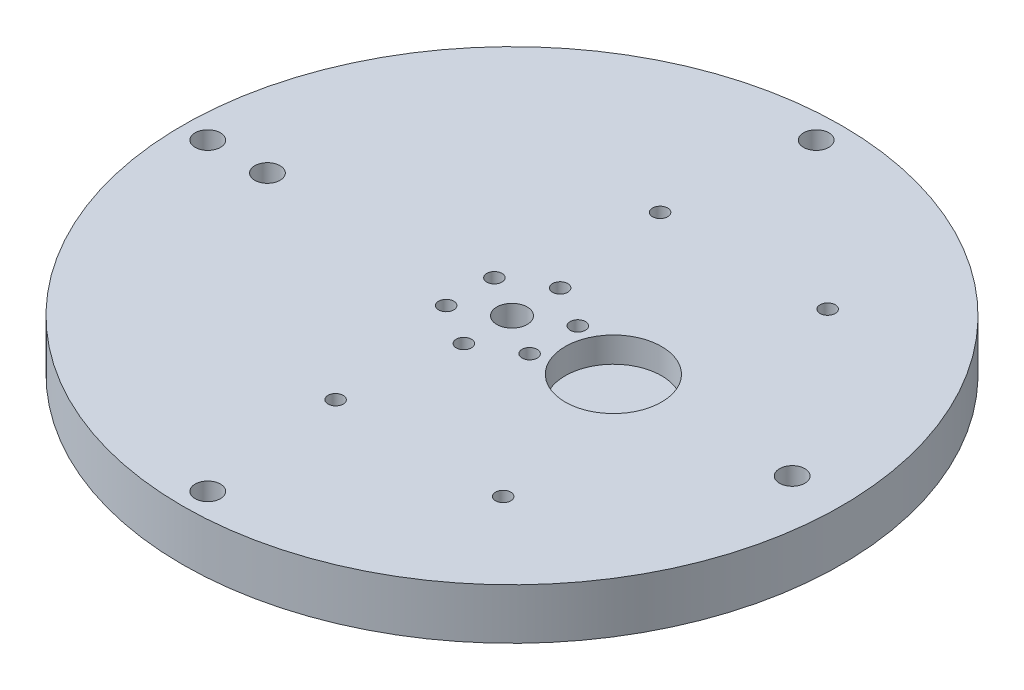
ISO-10303-21;
HEADER;
FILE_DESCRIPTION(('STEP AP214'),'2;1');
FILE_NAME('part.step','',(''),(''),'','','');
FILE_SCHEMA(('AUTOMOTIVE_DESIGN { 1 0 10303 214 1 1 1 1 }'));
ENDSEC;
DATA;
#1=APPLICATION_CONTEXT('core data for automotive mechanical design processes');
#2=APPLICATION_PROTOCOL_DEFINITION('international standard','automotive_design',2000,#1);
#3=PRODUCT_CONTEXT('',#1,'mechanical');
#4=PRODUCT('Part','Part','',(#3));
#5=PRODUCT_RELATED_PRODUCT_CATEGORY('part','',(#4));
#6=PRODUCT_DEFINITION_FORMATION('','',#4);
#7=PRODUCT_DEFINITION_CONTEXT('part definition',#1,'design');
#8=PRODUCT_DEFINITION('design','',#6,#7);
#9=PRODUCT_DEFINITION_SHAPE('','',#8);
#10=(LENGTH_UNIT() NAMED_UNIT(*) SI_UNIT(.MILLI.,.METRE.));
#11=(NAMED_UNIT(*) PLANE_ANGLE_UNIT() SI_UNIT($,.RADIAN.));
#12=(NAMED_UNIT(*) SI_UNIT($,.STERADIAN.) SOLID_ANGLE_UNIT());
#13=UNCERTAINTY_MEASURE_WITH_UNIT(LENGTH_MEASURE(1.E-05),#10,'distance_accuracy_value','');
#14=(GEOMETRIC_REPRESENTATION_CONTEXT(3) GLOBAL_UNCERTAINTY_ASSIGNED_CONTEXT((#13)) GLOBAL_UNIT_ASSIGNED_CONTEXT((#10,
#11,#12)) REPRESENTATION_CONTEXT('',''));
#15=CARTESIAN_POINT('',(0.,0.,0.));
#16=DIRECTION('',(0.,0.,1.));
#17=DIRECTION('',(1.,0.,0.));
#18=AXIS2_PLACEMENT_3D('',#15,#16,#17);
#19=CARTESIAN_POINT('',(-48.498731336808,0.,-0.260845552466508));
#20=DIRECTION('',(0.,1.,0.));
#21=DIRECTION('',(0.,0.,1.));
#22=AXIS2_PLACEMENT_3D('',#19,#20,#21);
#23=CYLINDRICAL_SURFACE('',#22,2.50000000000001);
#24=CARTESIAN_POINT('',(-48.498731336808,10.,-0.260845552466508));
#25=DIRECTION('',(0.,1.,0.));
#26=DIRECTION('',(0.,0.,1.));
#27=AXIS2_PLACEMENT_3D('',#24,#25,#26);
#28=CIRCLE('',#27,2.50000000000001);
#29=CARTESIAN_POINT('',(-48.498731336808,10.,2.2391544475335));
#30=VERTEX_POINT('',#29);
#31=EDGE_CURVE('E381',#30,#30,#28,.T.);
#32=ORIENTED_EDGE('',*,*,#31,.T.);
#33=EDGE_LOOP('',(#32));
#34=FACE_BOUND('',#33,.T.);
#35=CARTESIAN_POINT('',(-48.498731336808,5.,-0.260845552466508));
#36=DIRECTION('',(0.,-1.,0.));
#37=DIRECTION('',(0.,0.,-1.));
#38=AXIS2_PLACEMENT_3D('',#35,#36,#37);
#39=CIRCLE('',#38,2.50000000000001);
#40=CARTESIAN_POINT('',(-48.498731336808,5.,-2.76084555246652));
#41=VERTEX_POINT('',#40);
#42=EDGE_CURVE('E37',#41,#41,#39,.F.);
#43=ORIENTED_EDGE('',*,*,#42,.F.);
#44=EDGE_LOOP('',(#43));
#45=FACE_BOUND('',#44,.T.);
#46=ADVANCED_FACE('F33',(#34,#45),#23,.F.);
#47=CARTESIAN_POINT('',(-3.04873870426604,10.,-32.2608455524665));
#48=DIRECTION('',(0.,-1.,0.));
#49=DIRECTION('',(0.,0.,-1.));
#50=AXIS2_PLACEMENT_3D('',#47,#48,#49);
#51=CYLINDRICAL_SURFACE('',#50,1.50000000000003);
#52=CARTESIAN_POINT('',(-3.04873870426604,10.,-32.2608455524665));
#53=DIRECTION('',(0.,1.,0.));
#54=DIRECTION('',(0.,0.,1.));
#55=AXIS2_PLACEMENT_3D('',#52,#53,#54);
#56=CIRCLE('',#55,1.50000000000003);
#57=CARTESIAN_POINT('',(-3.04873870426604,10.,-30.7608455524665));
#58=VERTEX_POINT('',#57);
#59=EDGE_CURVE('E135',#58,#58,#56,.T.);
#60=ORIENTED_EDGE('',*,*,#59,.T.);
#61=EDGE_LOOP('',(#60));
#62=FACE_BOUND('',#61,.T.);
#63=CARTESIAN_POINT('',(-3.04873870426604,5.,-32.2608455524665));
#64=DIRECTION('',(0.,-1.,0.));
#65=DIRECTION('',(0.,0.,-1.));
#66=AXIS2_PLACEMENT_3D('',#63,#64,#65);
#67=CIRCLE('',#66,1.50000000000003);
#68=CARTESIAN_POINT('',(-3.04873870426604,5.,-33.7608455524666));
#69=VERTEX_POINT('',#68);
#70=EDGE_CURVE('E64',#69,#69,#67,.T.);
#71=ORIENTED_EDGE('',*,*,#70,.T.);
#72=EDGE_LOOP('',(#71));
#73=FACE_BOUND('',#72,.T.);
#74=ADVANCED_FACE('F182',(#62,#73),#51,.F.);
#75=CARTESIAN_POINT('',(30.0012686631919,10.,-32.2608455524665));
#76=DIRECTION('',(0.,-1.,0.));
#77=DIRECTION('',(0.,0.,-1.));
#78=AXIS2_PLACEMENT_3D('',#75,#76,#77);
#79=CYLINDRICAL_SURFACE('',#78,1.50000000000003);
#80=CARTESIAN_POINT('',(30.0012686631919,10.,-32.2608455524665));
#81=DIRECTION('',(0.,1.,0.));
#82=DIRECTION('',(0.,0.,1.));
#83=AXIS2_PLACEMENT_3D('',#80,#81,#82);
#84=CIRCLE('',#83,1.50000000000003);
#85=CARTESIAN_POINT('',(30.0012686631919,10.,-30.7608455524665));
#86=VERTEX_POINT('',#85);
#87=EDGE_CURVE('E132',#86,#86,#84,.T.);
#88=ORIENTED_EDGE('',*,*,#87,.T.);
#89=EDGE_LOOP('',(#88));
#90=FACE_BOUND('',#89,.T.);
#91=CARTESIAN_POINT('',(30.0012686631919,5.,-32.2608455524665));
#92=DIRECTION('',(0.,-1.,0.));
#93=DIRECTION('',(0.,0.,-1.));
#94=AXIS2_PLACEMENT_3D('',#91,#92,#93);
#95=CIRCLE('',#94,1.50000000000003);
#96=CARTESIAN_POINT('',(30.0012686631919,5.,-33.7608455524666));
#97=VERTEX_POINT('',#96);
#98=EDGE_CURVE('E62',#97,#97,#95,.T.);
#99=ORIENTED_EDGE('',*,*,#98,.T.);
#100=EDGE_LOOP('',(#99));
#101=FACE_BOUND('',#100,.T.);
#102=ADVANCED_FACE('F188',(#90,#101),#79,.F.);
#103=CARTESIAN_POINT('',(30.001268663192,10.,31.7391544475335));
#104=DIRECTION('',(0.,-1.,0.));
#105=DIRECTION('',(0.,0.,-1.));
#106=AXIS2_PLACEMENT_3D('',#103,#104,#105);
#107=CYLINDRICAL_SURFACE('',#106,1.50000000000003);
#108=CARTESIAN_POINT('',(30.001268663192,10.,31.7391544475335));
#109=DIRECTION('',(0.,1.,0.));
#110=DIRECTION('',(0.,0.,1.));
#111=AXIS2_PLACEMENT_3D('',#108,#109,#110);
#112=CIRCLE('',#111,1.50000000000003);
#113=CARTESIAN_POINT('',(30.001268663192,10.,33.2391544475335));
#114=VERTEX_POINT('',#113);
#115=EDGE_CURVE('E129',#114,#114,#112,.T.);
#116=ORIENTED_EDGE('',*,*,#115,.T.);
#117=EDGE_LOOP('',(#116));
#118=FACE_BOUND('',#117,.T.);
#119=CARTESIAN_POINT('',(30.001268663192,5.,31.7391544475335));
#120=DIRECTION('',(0.,-1.,0.));
#121=DIRECTION('',(0.,0.,-1.));
#122=AXIS2_PLACEMENT_3D('',#119,#120,#121);
#123=CIRCLE('',#122,1.50000000000003);
#124=CARTESIAN_POINT('',(30.001268663192,5.,30.2391544475334));
#125=VERTEX_POINT('',#124);
#126=EDGE_CURVE('E59',#125,#125,#123,.T.);
#127=ORIENTED_EDGE('',*,*,#126,.T.);
#128=EDGE_LOOP('',(#127));
#129=FACE_BOUND('',#128,.T.);
#130=ADVANCED_FACE('F314',(#118,#129),#107,.F.);
#131=CARTESIAN_POINT('',(-3.04873870426606,10.,31.7391544475334));
#132=DIRECTION('',(0.,-1.,0.));
#133=DIRECTION('',(0.,0.,-1.));
#134=AXIS2_PLACEMENT_3D('',#131,#132,#133);
#135=CYLINDRICAL_SURFACE('',#134,1.50000000000003);
#136=CARTESIAN_POINT('',(-3.04873870426606,10.,31.7391544475334));
#137=DIRECTION('',(0.,1.,0.));
#138=DIRECTION('',(0.,0.,1.));
#139=AXIS2_PLACEMENT_3D('',#136,#137,#138);
#140=CIRCLE('',#139,1.50000000000003);
#141=CARTESIAN_POINT('',(-3.04873870426606,10.,33.2391544475335));
#142=VERTEX_POINT('',#141);
#143=EDGE_CURVE('E126',#142,#142,#140,.T.);
#144=ORIENTED_EDGE('',*,*,#143,.T.);
#145=EDGE_LOOP('',(#144));
#146=FACE_BOUND('',#145,.T.);
#147=CARTESIAN_POINT('',(-3.04873870426606,5.,31.7391544475334));
#148=DIRECTION('',(0.,-1.,0.));
#149=DIRECTION('',(0.,0.,-1.));
#150=AXIS2_PLACEMENT_3D('',#147,#148,#149);
#151=CIRCLE('',#150,1.50000000000003);
#152=CARTESIAN_POINT('',(-3.04873870426606,5.,30.2391544475334));
#153=VERTEX_POINT('',#152);
#154=EDGE_CURVE('E55',#153,#153,#151,.T.);
#155=ORIENTED_EDGE('',*,*,#154,.T.);
#156=EDGE_LOOP('',(#155));
#157=FACE_BOUND('',#156,.T.);
#158=ADVANCED_FACE('F318',(#146,#157),#135,.F.);
#159=CARTESIAN_POINT('',(55.0012686631919,10.,-0.260845552466547));
#160=DIRECTION('',(0.,-1.,0.));
#161=DIRECTION('',(0.,0.,-1.));
#162=AXIS2_PLACEMENT_3D('',#159,#160,#161);
#163=CYLINDRICAL_SURFACE('',#162,2.49999999999999);
#164=CARTESIAN_POINT('',(55.0012686631919,10.,-0.260845552466547));
#165=DIRECTION('',(0.,1.,0.));
#166=DIRECTION('',(0.,0.,1.));
#167=AXIS2_PLACEMENT_3D('',#164,#165,#166);
#168=CIRCLE('',#167,2.49999999999999);
#169=CARTESIAN_POINT('',(55.0012686631919,10.,2.23915444753345));
#170=VERTEX_POINT('',#169);
#171=EDGE_CURVE('E103',#170,#170,#168,.T.);
#172=ORIENTED_EDGE('',*,*,#171,.T.);
#173=EDGE_LOOP('',(#172));
#174=FACE_BOUND('',#173,.T.);
#175=CARTESIAN_POINT('',(55.0012686631919,5.,-0.260845552466547));
#176=DIRECTION('',(0.,-1.,0.));
#177=DIRECTION('',(0.,0.,-1.));
#178=AXIS2_PLACEMENT_3D('',#175,#176,#177);
#179=CIRCLE('',#178,2.49999999999999);
#180=CARTESIAN_POINT('',(55.0012686631919,5.,-2.76084555246654));
#181=VERTEX_POINT('',#180);
#182=EDGE_CURVE('E52',#181,#181,#179,.T.);
#183=ORIENTED_EDGE('',*,*,#182,.T.);
#184=EDGE_LOOP('',(#183));
#185=FACE_BOUND('',#184,.T.);
#186=ADVANCED_FACE('F35',(#174,#185),#163,.F.);
#187=CARTESIAN_POINT('',(0.,10.,-9.5));
#188=DIRECTION('',(0.,-1.,0.));
#189=DIRECTION('',(0.,0.,-1.));
#190=AXIS2_PLACEMENT_3D('',#187,#188,#189);
#191=CYLINDRICAL_SURFACE('',#190,1.5);
#192=CARTESIAN_POINT('',(0.,10.,-9.5));
#193=DIRECTION('',(0.,1.,0.));
#194=DIRECTION('',(0.,0.,1.));
#195=AXIS2_PLACEMENT_3D('',#192,#193,#194);
#196=CIRCLE('',#195,1.5);
#197=CARTESIAN_POINT('',(0.,10.,-8.));
#198=VERTEX_POINT('',#197);
#199=EDGE_CURVE('E46',#198,#198,#196,.T.);
#200=ORIENTED_EDGE('',*,*,#199,.T.);
#201=EDGE_LOOP('',(#200));
#202=FACE_BOUND('',#201,.T.);
#203=CARTESIAN_POINT('',(0.,0.,-9.5));
#204=DIRECTION('',(0.,1.,0.));
#205=DIRECTION('',(0.,0.,1.));
#206=AXIS2_PLACEMENT_3D('',#203,#204,#205);
#207=CIRCLE('',#206,1.5);
#208=CARTESIAN_POINT('',(0.,0.,-8.));
#209=VERTEX_POINT('',#208);
#210=EDGE_CURVE('E98',#209,#209,#207,.T.);
#211=ORIENTED_EDGE('',*,*,#210,.F.);
#212=EDGE_LOOP('',(#211));
#213=FACE_BOUND('',#212,.T.);
#214=ADVANCED_FACE('F158',(#202,#213),#191,.F.);
#215=CARTESIAN_POINT('',(8.22724133595243,10.,-4.75000000000047));
#216=DIRECTION('',(0.,-1.,0.));
#217=DIRECTION('',(0.,0.,-1.));
#218=AXIS2_PLACEMENT_3D('',#215,#216,#217);
#219=CYLINDRICAL_SURFACE('',#218,1.50000000000014);
#220=CARTESIAN_POINT('',(8.22724133595243,10.,-4.75000000000047));
#221=DIRECTION('',(0.,1.,0.));
#222=DIRECTION('',(0.,0.,1.));
#223=AXIS2_PLACEMENT_3D('',#220,#221,#222);
#224=CIRCLE('',#223,1.50000000000014);
#225=CARTESIAN_POINT('',(8.22724133595243,10.,-3.25000000000032));
#226=VERTEX_POINT('',#225);
#227=EDGE_CURVE('E153',#226,#226,#224,.T.);
#228=ORIENTED_EDGE('',*,*,#227,.T.);
#229=EDGE_LOOP('',(#228));
#230=FACE_BOUND('',#229,.T.);
#231=CARTESIAN_POINT('',(8.22724133595243,0.,-4.75000000000047));
#232=DIRECTION('',(0.,1.,0.));
#233=DIRECTION('',(0.,0.,1.));
#234=AXIS2_PLACEMENT_3D('',#231,#232,#233);
#235=CIRCLE('',#234,1.50000000000014);
#236=CARTESIAN_POINT('',(8.22724133595243,0.,-3.25000000000032));
#237=VERTEX_POINT('',#236);
#238=EDGE_CURVE('E96',#237,#237,#235,.T.);
#239=ORIENTED_EDGE('',*,*,#238,.F.);
#240=EDGE_LOOP('',(#239));
#241=FACE_BOUND('',#240,.T.);
#242=ADVANCED_FACE('F283',(#230,#241),#219,.F.);
#243=CARTESIAN_POINT('',(8.22724133595298,10.,4.74999999999953));
#244=DIRECTION('',(0.,-1.,0.));
#245=DIRECTION('',(0.,0.,-1.));
#246=AXIS2_PLACEMENT_3D('',#243,#244,#245);
#247=CYLINDRICAL_SURFACE('',#246,1.50000000000068);
#248=CARTESIAN_POINT('',(8.22724133595298,10.,4.74999999999953));
#249=DIRECTION('',(0.,1.,0.));
#250=DIRECTION('',(0.,0.,1.));
#251=AXIS2_PLACEMENT_3D('',#248,#249,#250);
#252=CIRCLE('',#251,1.50000000000068);
#253=CARTESIAN_POINT('',(8.22724133595298,10.,6.25000000000021));
#254=VERTEX_POINT('',#253);
#255=EDGE_CURVE('E150',#254,#254,#252,.T.);
#256=ORIENTED_EDGE('',*,*,#255,.T.);
#257=EDGE_LOOP('',(#256));
#258=FACE_BOUND('',#257,.T.);
#259=CARTESIAN_POINT('',(8.22724133595298,0.,4.74999999999953));
#260=DIRECTION('',(0.,1.,0.));
#261=DIRECTION('',(0.,0.,1.));
#262=AXIS2_PLACEMENT_3D('',#259,#260,#261);
#263=CIRCLE('',#262,1.50000000000068);
#264=CARTESIAN_POINT('',(8.22724133595298,0.,6.25000000000021));
#265=VERTEX_POINT('',#264);
#266=EDGE_CURVE('E93',#265,#265,#263,.T.);
#267=ORIENTED_EDGE('',*,*,#266,.F.);
#268=EDGE_LOOP('',(#267));
#269=FACE_BOUND('',#268,.T.);
#270=ADVANCED_FACE('F285',(#258,#269),#247,.F.);
#271=CARTESIAN_POINT('',(1.07769812943697E-12,10.,9.5));
#272=DIRECTION('',(0.,-1.,0.));
#273=DIRECTION('',(0.,0.,-1.));
#274=AXIS2_PLACEMENT_3D('',#271,#272,#273);
#275=CYLINDRICAL_SURFACE('',#274,1.50000000000109);
#276=CARTESIAN_POINT('',(1.07769812943697E-12,10.,9.5));
#277=DIRECTION('',(0.,1.,0.));
#278=DIRECTION('',(0.,0.,1.));
#279=AXIS2_PLACEMENT_3D('',#276,#277,#278);
#280=CIRCLE('',#279,1.50000000000109);
#281=CARTESIAN_POINT('',(1.07769812943697E-12,10.,11.0000000000011));
#282=VERTEX_POINT('',#281);
#283=EDGE_CURVE('E147',#282,#282,#280,.T.);
#284=ORIENTED_EDGE('',*,*,#283,.T.);
#285=EDGE_LOOP('',(#284));
#286=FACE_BOUND('',#285,.T.);
#287=CARTESIAN_POINT('',(1.07769812943697E-12,0.,9.5));
#288=DIRECTION('',(0.,1.,0.));
#289=DIRECTION('',(0.,0.,1.));
#290=AXIS2_PLACEMENT_3D('',#287,#288,#289);
#291=CIRCLE('',#290,1.50000000000109);
#292=CARTESIAN_POINT('',(1.07769812943697E-12,0.,11.0000000000011));
#293=VERTEX_POINT('',#292);
#294=EDGE_CURVE('E90',#293,#293,#291,.T.);
#295=ORIENTED_EDGE('',*,*,#294,.F.);
#296=EDGE_LOOP('',(#295));
#297=FACE_BOUND('',#296,.T.);
#298=ADVANCED_FACE('F292',(#286,#297),#275,.F.);
#299=CARTESIAN_POINT('',(-8.22724133595136,10.,4.75000000000047));
#300=DIRECTION('',(0.,-1.,0.));
#301=DIRECTION('',(0.,0.,-1.));
#302=AXIS2_PLACEMENT_3D('',#299,#300,#301);
#303=CYLINDRICAL_SURFACE('',#302,1.50000000000099);
#304=CARTESIAN_POINT('',(-8.22724133595136,10.,4.75000000000047));
#305=DIRECTION('',(0.,1.,0.));
#306=DIRECTION('',(0.,0.,1.));
#307=AXIS2_PLACEMENT_3D('',#304,#305,#306);
#308=CIRCLE('',#307,1.50000000000099);
#309=CARTESIAN_POINT('',(-8.22724133595136,10.,6.25000000000146));
#310=VERTEX_POINT('',#309);
#311=EDGE_CURVE('E144',#310,#310,#308,.T.);
#312=ORIENTED_EDGE('',*,*,#311,.T.);
#313=EDGE_LOOP('',(#312));
#314=FACE_BOUND('',#313,.T.);
#315=CARTESIAN_POINT('',(-8.22724133595136,0.,4.75000000000047));
#316=DIRECTION('',(0.,1.,0.));
#317=DIRECTION('',(0.,0.,1.));
#318=AXIS2_PLACEMENT_3D('',#315,#316,#317);
#319=CIRCLE('',#318,1.50000000000099);
#320=CARTESIAN_POINT('',(-8.22724133595136,0.,6.25000000000146));
#321=VERTEX_POINT('',#320);
#322=EDGE_CURVE('E87',#321,#321,#319,.T.);
#323=ORIENTED_EDGE('',*,*,#322,.F.);
#324=EDGE_LOOP('',(#323));
#325=FACE_BOUND('',#324,.T.);
#326=ADVANCED_FACE('F298',(#314,#325),#303,.F.);
#327=CARTESIAN_POINT('',(-8.2272413359519,10.,-4.74999999999953));
#328=DIRECTION('',(0.,-1.,0.));
#329=DIRECTION('',(0.,0.,-1.));
#330=AXIS2_PLACEMENT_3D('',#327,#328,#329);
#331=CYLINDRICAL_SURFACE('',#330,1.50000000000051);
#332=CARTESIAN_POINT('',(-8.2272413359519,10.,-4.74999999999953));
#333=DIRECTION('',(0.,1.,0.));
#334=DIRECTION('',(0.,0.,1.));
#335=AXIS2_PLACEMENT_3D('',#332,#333,#334);
#336=CIRCLE('',#335,1.50000000000051);
#337=CARTESIAN_POINT('',(-8.2272413359519,10.,-3.24999999999902));
#338=VERTEX_POINT('',#337);
#339=EDGE_CURVE('E141',#338,#338,#336,.T.);
#340=ORIENTED_EDGE('',*,*,#339,.T.);
#341=EDGE_LOOP('',(#340));
#342=FACE_BOUND('',#341,.T.);
#343=CARTESIAN_POINT('',(-8.2272413359519,0.,-4.74999999999953));
#344=DIRECTION('',(0.,1.,0.));
#345=DIRECTION('',(0.,0.,1.));
#346=AXIS2_PLACEMENT_3D('',#343,#344,#345);
#347=CIRCLE('',#346,1.50000000000051);
#348=CARTESIAN_POINT('',(-8.2272413359519,0.,-3.24999999999902));
#349=VERTEX_POINT('',#348);
#350=EDGE_CURVE('E84',#349,#349,#347,.T.);
#351=ORIENTED_EDGE('',*,*,#350,.F.);
#352=EDGE_LOOP('',(#351));
#353=FACE_BOUND('',#352,.T.);
#354=ADVANCED_FACE('F302',(#342,#353),#331,.F.);
#355=CARTESIAN_POINT('',(20.,10.,0.));
#356=DIRECTION('',(0.,-1.,0.));
#357=DIRECTION('',(0.,0.,-1.));
#358=AXIS2_PLACEMENT_3D('',#355,#356,#357);
#359=CYLINDRICAL_SURFACE('',#358,9.5);
#360=CARTESIAN_POINT('',(20.,5.,0.));
#361=DIRECTION('',(0.,1.,0.));
#362=DIRECTION('',(0.,0.,1.));
#363=AXIS2_PLACEMENT_3D('',#360,#361,#362);
#364=CIRCLE('',#363,9.5);
#365=CARTESIAN_POINT('',(20.,5.,9.5));
#366=VERTEX_POINT('',#365);
#367=EDGE_CURVE('E10',#366,#366,#364,.T.);
#368=ORIENTED_EDGE('',*,*,#367,.F.);
#369=EDGE_LOOP('',(#368));
#370=FACE_BOUND('',#369,.T.);
#371=CARTESIAN_POINT('',(20.,10.,0.));
#372=DIRECTION('',(0.,1.,0.));
#373=DIRECTION('',(0.,0.,1.));
#374=AXIS2_PLACEMENT_3D('',#371,#372,#373);
#375=CIRCLE('',#374,9.5);
#376=CARTESIAN_POINT('',(20.,10.,9.5));
#377=VERTEX_POINT('',#376);
#378=EDGE_CURVE('E138',#377,#377,#375,.T.);
#379=ORIENTED_EDGE('',*,*,#378,.T.);
#380=EDGE_LOOP('',(#379));
#381=FACE_BOUND('',#380,.T.);
#382=ADVANCED_FACE('F306',(#370,#381),#359,.F.);
#383=CARTESIAN_POINT('',(0.,10.,0.));
#384=DIRECTION('',(0.,-1.,0.));
#385=DIRECTION('',(0.,0.,-1.));
#386=AXIS2_PLACEMENT_3D('',#383,#384,#385);
#387=CYLINDRICAL_SURFACE('',#386,65.);
#388=CARTESIAN_POINT('',(0.,10.,0.));
#389=DIRECTION('',(0.,1.,0.));
#390=DIRECTION('',(0.,0.,1.));
#391=AXIS2_PLACEMENT_3D('',#388,#389,#390);
#392=CIRCLE('',#391,65.);
#393=CARTESIAN_POINT('',(0.,10.,65.));
#394=VERTEX_POINT('',#393);
#395=EDGE_CURVE('E123',#394,#394,#392,.T.);
#396=ORIENTED_EDGE('',*,*,#395,.F.);
#397=EDGE_LOOP('',(#396));
#398=FACE_BOUND('',#397,.T.);
#399=CARTESIAN_POINT('',(0.,0.,0.));
#400=DIRECTION('',(0.,1.,0.));
#401=DIRECTION('',(0.,0.,1.));
#402=AXIS2_PLACEMENT_3D('',#399,#400,#401);
#403=CIRCLE('',#402,65.);
#404=CARTESIAN_POINT('',(0.,0.,65.));
#405=VERTEX_POINT('',#404);
#406=EDGE_CURVE('E81',#405,#405,#403,.T.);
#407=ORIENTED_EDGE('',*,*,#406,.T.);
#408=EDGE_LOOP('',(#407));
#409=FACE_BOUND('',#408,.T.);
#410=ADVANCED_FACE('F309',(#398,#409),#387,.T.);
#411=CARTESIAN_POINT('',(0.,10.,60.));
#412=DIRECTION('',(0.,-1.,0.));
#413=DIRECTION('',(0.,0.,-1.));
#414=AXIS2_PLACEMENT_3D('',#411,#412,#413);
#415=CYLINDRICAL_SURFACE('',#414,2.5);
#416=CARTESIAN_POINT('',(0.,10.,60.));
#417=DIRECTION('',(0.,1.,0.));
#418=DIRECTION('',(0.,0.,1.));
#419=AXIS2_PLACEMENT_3D('',#416,#417,#418);
#420=CIRCLE('',#419,2.5);
#421=CARTESIAN_POINT('',(0.,10.,62.5));
#422=VERTEX_POINT('',#421);
#423=EDGE_CURVE('E120',#422,#422,#420,.T.);
#424=ORIENTED_EDGE('',*,*,#423,.T.);
#425=EDGE_LOOP('',(#424));
#426=FACE_BOUND('',#425,.T.);
#427=CARTESIAN_POINT('',(0.,0.,60.));
#428=DIRECTION('',(0.,1.,0.));
#429=DIRECTION('',(0.,0.,1.));
#430=AXIS2_PLACEMENT_3D('',#427,#428,#429);
#431=CIRCLE('',#430,2.5);
#432=CARTESIAN_POINT('',(0.,0.,62.5));
#433=VERTEX_POINT('',#432);
#434=EDGE_CURVE('E75',#433,#433,#431,.T.);
#435=ORIENTED_EDGE('',*,*,#434,.F.);
#436=EDGE_LOOP('',(#435));
#437=FACE_BOUND('',#436,.T.);
#438=ADVANCED_FACE('F325',(#426,#437),#415,.F.);
#439=CARTESIAN_POINT('',(-60.,10.,0.));
#440=DIRECTION('',(0.,-1.,0.));
#441=DIRECTION('',(0.,0.,-1.));
#442=AXIS2_PLACEMENT_3D('',#439,#440,#441);
#443=CYLINDRICAL_SURFACE('',#442,2.5);
#444=CARTESIAN_POINT('',(-60.,10.,0.));
#445=DIRECTION('',(0.,1.,0.));
#446=DIRECTION('',(0.,0.,1.));
#447=AXIS2_PLACEMENT_3D('',#444,#445,#446);
#448=CIRCLE('',#447,2.5);
#449=CARTESIAN_POINT('',(-60.,10.,2.5));
#450=VERTEX_POINT('',#449);
#451=EDGE_CURVE('E112',#450,#450,#448,.T.);
#452=ORIENTED_EDGE('',*,*,#451,.T.);
#453=EDGE_LOOP('',(#452));
#454=FACE_BOUND('',#453,.T.);
#455=CARTESIAN_POINT('',(-60.,0.,0.));
#456=DIRECTION('',(0.,1.,0.));
#457=DIRECTION('',(0.,0.,1.));
#458=AXIS2_PLACEMENT_3D('',#455,#456,#457);
#459=CIRCLE('',#458,2.5);
#460=CARTESIAN_POINT('',(-60.,0.,2.5));
#461=VERTEX_POINT('',#460);
#462=EDGE_CURVE('E70',#461,#461,#459,.T.);
#463=ORIENTED_EDGE('',*,*,#462,.F.);
#464=EDGE_LOOP('',(#463));
#465=FACE_BOUND('',#464,.T.);
#466=ADVANCED_FACE('F177',(#454,#465),#443,.F.);
#467=CARTESIAN_POINT('',(0.,10.,-60.));
#468=DIRECTION('',(0.,-1.,0.));
#469=DIRECTION('',(0.,0.,-1.));
#470=AXIS2_PLACEMENT_3D('',#467,#468,#469);
#471=CYLINDRICAL_SURFACE('',#470,2.5);
#472=CARTESIAN_POINT('',(0.,10.,-60.));
#473=DIRECTION('',(0.,1.,0.));
#474=DIRECTION('',(0.,0.,1.));
#475=AXIS2_PLACEMENT_3D('',#472,#473,#474);
#476=CIRCLE('',#475,2.5);
#477=CARTESIAN_POINT('',(0.,10.,-57.5));
#478=VERTEX_POINT('',#477);
#479=EDGE_CURVE('E107',#478,#478,#476,.T.);
#480=ORIENTED_EDGE('',*,*,#479,.T.);
#481=EDGE_LOOP('',(#480));
#482=FACE_BOUND('',#481,.T.);
#483=CARTESIAN_POINT('',(0.,0.,-60.));
#484=DIRECTION('',(0.,1.,0.));
#485=DIRECTION('',(0.,0.,1.));
#486=AXIS2_PLACEMENT_3D('',#483,#484,#485);
#487=CIRCLE('',#486,2.5);
#488=CARTESIAN_POINT('',(0.,0.,-57.5));
#489=VERTEX_POINT('',#488);
#490=EDGE_CURVE('E66',#489,#489,#487,.T.);
#491=ORIENTED_EDGE('',*,*,#490,.F.);
#492=EDGE_LOOP('',(#491));
#493=FACE_BOUND('',#492,.T.);
#494=ADVANCED_FACE('F172',(#482,#493),#471,.F.);
#495=CARTESIAN_POINT('',(0.,10.,0.));
#496=DIRECTION('',(0.,-1.,0.));
#497=DIRECTION('',(0.,0.,-1.));
#498=AXIS2_PLACEMENT_3D('',#495,#496,#497);
#499=CYLINDRICAL_SURFACE('',#498,3.);
#500=CARTESIAN_POINT('',(0.,10.,0.));
#501=DIRECTION('',(0.,1.,0.));
#502=DIRECTION('',(0.,0.,1.));
#503=AXIS2_PLACEMENT_3D('',#500,#501,#502);
#504=CIRCLE('',#503,3.);
#505=CARTESIAN_POINT('',(0.,10.,3.));
#506=VERTEX_POINT('',#505);
#507=EDGE_CURVE('E41',#506,#506,#504,.T.);
#508=ORIENTED_EDGE('',*,*,#507,.T.);
#509=EDGE_LOOP('',(#508));
#510=FACE_BOUND('',#509,.T.);
#511=CARTESIAN_POINT('',(0.,0.,0.));
#512=DIRECTION('',(0.,1.,0.));
#513=DIRECTION('',(0.,0.,1.));
#514=AXIS2_PLACEMENT_3D('',#511,#512,#513);
#515=CIRCLE('',#514,3.);
#516=CARTESIAN_POINT('',(0.,0.,3.));
#517=VERTEX_POINT('',#516);
#518=EDGE_CURVE('E50',#517,#517,#515,.T.);
#519=ORIENTED_EDGE('',*,*,#518,.F.);
#520=EDGE_LOOP('',(#519));
#521=FACE_BOUND('',#520,.T.);
#522=ADVANCED_FACE('F165',(#510,#521),#499,.F.);
#523=CARTESIAN_POINT('',(0.,10.,0.));
#524=DIRECTION('',(0.,1.,0.));
#525=DIRECTION('',(0.,0.,1.));
#526=AXIS2_PLACEMENT_3D('',#523,#524,#525);
#527=PLANE('',#526);
#528=ORIENTED_EDGE('',*,*,#31,.F.);
#529=EDGE_LOOP('',(#528));
#530=FACE_BOUND('',#529,.T.);
#531=ORIENTED_EDGE('',*,*,#171,.F.);
#532=EDGE_LOOP('',(#531));
#533=FACE_BOUND('',#532,.T.);
#534=ORIENTED_EDGE('',*,*,#479,.F.);
#535=EDGE_LOOP('',(#534));
#536=FACE_BOUND('',#535,.T.);
#537=ORIENTED_EDGE('',*,*,#451,.F.);
#538=EDGE_LOOP('',(#537));
#539=FACE_BOUND('',#538,.T.);
#540=ORIENTED_EDGE('',*,*,#423,.F.);
#541=EDGE_LOOP('',(#540));
#542=FACE_BOUND('',#541,.T.);
#543=ORIENTED_EDGE('',*,*,#395,.T.);
#544=EDGE_LOOP('',(#543));
#545=FACE_BOUND('',#544,.T.);
#546=ORIENTED_EDGE('',*,*,#143,.F.);
#547=EDGE_LOOP('',(#546));
#548=FACE_BOUND('',#547,.T.);
#549=ORIENTED_EDGE('',*,*,#115,.F.);
#550=EDGE_LOOP('',(#549));
#551=FACE_BOUND('',#550,.T.);
#552=ORIENTED_EDGE('',*,*,#87,.F.);
#553=EDGE_LOOP('',(#552));
#554=FACE_BOUND('',#553,.T.);
#555=ORIENTED_EDGE('',*,*,#59,.F.);
#556=EDGE_LOOP('',(#555));
#557=FACE_BOUND('',#556,.T.);
#558=ORIENTED_EDGE('',*,*,#378,.F.);
#559=EDGE_LOOP('',(#558));
#560=FACE_BOUND('',#559,.T.);
#561=ORIENTED_EDGE('',*,*,#339,.F.);
#562=EDGE_LOOP('',(#561));
#563=FACE_BOUND('',#562,.T.);
#564=ORIENTED_EDGE('',*,*,#311,.F.);
#565=EDGE_LOOP('',(#564));
#566=FACE_BOUND('',#565,.T.);
#567=ORIENTED_EDGE('',*,*,#283,.F.);
#568=EDGE_LOOP('',(#567));
#569=FACE_BOUND('',#568,.T.);
#570=ORIENTED_EDGE('',*,*,#255,.F.);
#571=EDGE_LOOP('',(#570));
#572=FACE_BOUND('',#571,.T.);
#573=ORIENTED_EDGE('',*,*,#227,.F.);
#574=EDGE_LOOP('',(#573));
#575=FACE_BOUND('',#574,.T.);
#576=ORIENTED_EDGE('',*,*,#199,.F.);
#577=EDGE_LOOP('',(#576));
#578=FACE_BOUND('',#577,.T.);
#579=ORIENTED_EDGE('',*,*,#507,.F.);
#580=EDGE_LOOP('',(#579));
#581=FACE_BOUND('',#580,.T.);
#582=ADVANCED_FACE('F161',(#530,#533,#536,#539,#542,#545,#548,#551,#554,#557,#560,#563,#566,
#569,#572,#575,#578,#581),#527,.T.);
#583=CARTESIAN_POINT('',(0.,0.,0.));
#584=DIRECTION('',(0.,1.,0.));
#585=DIRECTION('',(0.,0.,1.));
#586=AXIS2_PLACEMENT_3D('',#583,#584,#585);
#587=PLANE('',#586);
#588=CARTESIAN_POINT('',(-48.498731336808,0.,-0.260845552466508));
#589=DIRECTION('',(0.,-1.,0.));
#590=DIRECTION('',(0.,0.,-1.));
#591=AXIS2_PLACEMENT_3D('',#588,#589,#590);
#592=CIRCLE('',#591,5.);
#593=CARTESIAN_POINT('',(-48.498731336808,0.,-5.26084555246651));
#594=VERTEX_POINT('',#593);
#595=EDGE_CURVE('E247',#594,#594,#592,.T.);
#596=ORIENTED_EDGE('',*,*,#595,.F.);
#597=EDGE_LOOP('',(#596));
#598=FACE_BOUND('',#597,.T.);
#599=CARTESIAN_POINT('',(-3.04873870426604,0.,-32.2608455524665));
#600=DIRECTION('',(0.,-1.,0.));
#601=DIRECTION('',(0.,0.,-1.));
#602=AXIS2_PLACEMENT_3D('',#599,#600,#601);
#603=CIRCLE('',#602,5.);
#604=CARTESIAN_POINT('',(-3.04873870426604,0.,-37.2608455524666));
#605=VERTEX_POINT('',#604);
#606=EDGE_CURVE('E251',#605,#605,#603,.T.);
#607=ORIENTED_EDGE('',*,*,#606,.F.);
#608=EDGE_LOOP('',(#607));
#609=FACE_BOUND('',#608,.T.);
#610=CARTESIAN_POINT('',(30.0012686631919,0.,-32.2608455524665));
#611=DIRECTION('',(0.,-1.,0.));
#612=DIRECTION('',(0.,0.,-1.));
#613=AXIS2_PLACEMENT_3D('',#610,#611,#612);
#614=CIRCLE('',#613,5.);
#615=CARTESIAN_POINT('',(30.0012686631919,0.,-37.2608455524665));
#616=VERTEX_POINT('',#615);
#617=EDGE_CURVE('E255',#616,#616,#614,.T.);
#618=ORIENTED_EDGE('',*,*,#617,.F.);
#619=EDGE_LOOP('',(#618));
#620=FACE_BOUND('',#619,.T.);
#621=CARTESIAN_POINT('',(55.0012686631919,0.,-0.260845552466547));
#622=DIRECTION('',(0.,-1.,0.));
#623=DIRECTION('',(0.,0.,-1.));
#624=AXIS2_PLACEMENT_3D('',#621,#622,#623);
#625=CIRCLE('',#624,4.99999999999998);
#626=CARTESIAN_POINT('',(55.0012686631919,0.,-5.26084555246653));
#627=VERTEX_POINT('',#626);
#628=EDGE_CURVE('E259',#627,#627,#625,.T.);
#629=ORIENTED_EDGE('',*,*,#628,.F.);
#630=EDGE_LOOP('',(#629));
#631=FACE_BOUND('',#630,.T.);
#632=CARTESIAN_POINT('',(-3.04873870426606,0.,31.7391544475334));
#633=DIRECTION('',(0.,-1.,0.));
#634=DIRECTION('',(0.,0.,-1.));
#635=AXIS2_PLACEMENT_3D('',#632,#633,#634);
#636=CIRCLE('',#635,5.);
#637=CARTESIAN_POINT('',(-3.04873870426606,0.,26.7391544475334));
#638=VERTEX_POINT('',#637);
#639=EDGE_CURVE('E263',#638,#638,#636,.T.);
#640=ORIENTED_EDGE('',*,*,#639,.F.);
#641=EDGE_LOOP('',(#640));
#642=FACE_BOUND('',#641,.T.);
#643=CARTESIAN_POINT('',(30.001268663192,0.,31.7391544475335));
#644=DIRECTION('',(0.,-1.,0.));
#645=DIRECTION('',(0.,0.,-1.));
#646=AXIS2_PLACEMENT_3D('',#643,#644,#645);
#647=CIRCLE('',#646,4.99999999999999);
#648=CARTESIAN_POINT('',(30.001268663192,0.,26.7391544475335));
#649=VERTEX_POINT('',#648);
#650=EDGE_CURVE('E115',#649,#649,#647,.T.);
#651=ORIENTED_EDGE('',*,*,#650,.F.);
#652=EDGE_LOOP('',(#651));
#653=FACE_BOUND('',#652,.T.);
#654=ORIENTED_EDGE('',*,*,#490,.T.);
#655=EDGE_LOOP('',(#654));
#656=FACE_BOUND('',#655,.T.);
#657=ORIENTED_EDGE('',*,*,#462,.T.);
#658=EDGE_LOOP('',(#657));
#659=FACE_BOUND('',#658,.T.);
#660=ORIENTED_EDGE('',*,*,#434,.T.);
#661=EDGE_LOOP('',(#660));
#662=FACE_BOUND('',#661,.T.);
#663=ORIENTED_EDGE('',*,*,#406,.F.);
#664=EDGE_LOOP('',(#663));
#665=FACE_BOUND('',#664,.T.);
#666=ORIENTED_EDGE('',*,*,#350,.T.);
#667=EDGE_LOOP('',(#666));
#668=FACE_BOUND('',#667,.T.);
#669=ORIENTED_EDGE('',*,*,#322,.T.);
#670=EDGE_LOOP('',(#669));
#671=FACE_BOUND('',#670,.T.);
#672=ORIENTED_EDGE('',*,*,#294,.T.);
#673=EDGE_LOOP('',(#672));
#674=FACE_BOUND('',#673,.T.);
#675=ORIENTED_EDGE('',*,*,#266,.T.);
#676=EDGE_LOOP('',(#675));
#677=FACE_BOUND('',#676,.T.);
#678=ORIENTED_EDGE('',*,*,#238,.T.);
#679=EDGE_LOOP('',(#678));
#680=FACE_BOUND('',#679,.T.);
#681=ORIENTED_EDGE('',*,*,#210,.T.);
#682=EDGE_LOOP('',(#681));
#683=FACE_BOUND('',#682,.T.);
#684=ORIENTED_EDGE('',*,*,#518,.T.);
#685=EDGE_LOOP('',(#684));
#686=FACE_BOUND('',#685,.T.);
#687=ADVANCED_FACE('F164',(#598,#609,#620,#631,#642,#653,#656,#659,#662,#665,#668,#671,#674,
#677,#680,#683,#686),#587,.F.);
#688=CARTESIAN_POINT('',(0.,5.,0.));
#689=DIRECTION('',(0.,1.,0.));
#690=DIRECTION('',(0.,0.,1.));
#691=AXIS2_PLACEMENT_3D('',#688,#689,#690);
#692=PLANE('',#691);
#693=ORIENTED_EDGE('',*,*,#367,.T.);
#694=EDGE_LOOP('',(#693));
#695=FACE_BOUND('',#694,.T.);
#696=ADVANCED_FACE('F237',(#695),#692,.T.);
#697=CARTESIAN_POINT('',(30.001268663192,5.,31.7391544475335));
#698=DIRECTION('',(0.,-1.,0.));
#699=DIRECTION('',(0.,0.,-1.));
#700=AXIS2_PLACEMENT_3D('',#697,#698,#699);
#701=CYLINDRICAL_SURFACE('',#700,4.99999999999999);
#702=CARTESIAN_POINT('',(30.001268663192,5.,31.7391544475335));
#703=DIRECTION('',(0.,-1.,0.));
#704=DIRECTION('',(0.,0.,-1.));
#705=AXIS2_PLACEMENT_3D('',#702,#703,#704);
#706=CIRCLE('',#705,4.99999999999999);
#707=CARTESIAN_POINT('',(30.001268663192,5.,26.7391544475335));
#708=VERTEX_POINT('',#707);
#709=EDGE_CURVE('E56',#708,#708,#706,.T.);
#710=ORIENTED_EDGE('',*,*,#709,.F.);
#711=EDGE_LOOP('',(#710));
#712=FACE_BOUND('',#711,.T.);
#713=ORIENTED_EDGE('',*,*,#650,.T.);
#714=EDGE_LOOP('',(#713));
#715=FACE_BOUND('',#714,.T.);
#716=ADVANCED_FACE('F233',(#712,#715),#701,.F.);
#717=CARTESIAN_POINT('',(30.001268663192,5.,31.7391544475335));
#718=DIRECTION('',(0.,-1.,0.));
#719=DIRECTION('',(0.,0.,-1.));
#720=AXIS2_PLACEMENT_3D('',#717,#718,#719);
#721=PLANE('',#720);
#722=ORIENTED_EDGE('',*,*,#126,.F.);
#723=EDGE_LOOP('',(#722));
#724=FACE_BOUND('',#723,.T.);
#725=ORIENTED_EDGE('',*,*,#709,.T.);
#726=EDGE_LOOP('',(#725));
#727=FACE_BOUND('',#726,.T.);
#728=ADVANCED_FACE('F205',(#724,#727),#721,.T.);
#729=CARTESIAN_POINT('',(-3.04873870426606,5.,31.7391544475334));
#730=DIRECTION('',(0.,-1.,0.));
#731=DIRECTION('',(0.,0.,-1.));
#732=AXIS2_PLACEMENT_3D('',#729,#730,#731);
#733=CYLINDRICAL_SURFACE('',#732,5.);
#734=CARTESIAN_POINT('',(-3.04873870426606,5.,31.7391544475334));
#735=DIRECTION('',(0.,-1.,0.));
#736=DIRECTION('',(0.,0.,-1.));
#737=AXIS2_PLACEMENT_3D('',#734,#735,#736);
#738=CIRCLE('',#737,5.);
#739=CARTESIAN_POINT('',(-3.04873870426606,5.,26.7391544475334));
#740=VERTEX_POINT('',#739);
#741=EDGE_CURVE('E385',#740,#740,#738,.T.);
#742=ORIENTED_EDGE('',*,*,#741,.F.);
#743=EDGE_LOOP('',(#742));
#744=FACE_BOUND('',#743,.T.);
#745=ORIENTED_EDGE('',*,*,#639,.T.);
#746=EDGE_LOOP('',(#745));
#747=FACE_BOUND('',#746,.T.);
#748=ADVANCED_FACE('F201',(#744,#747),#733,.F.);
#749=CARTESIAN_POINT('',(-3.04873870426606,5.,31.7391544475334));
#750=DIRECTION('',(0.,-1.,0.));
#751=DIRECTION('',(0.,0.,-1.));
#752=AXIS2_PLACEMENT_3D('',#749,#750,#751);
#753=PLANE('',#752);
#754=ORIENTED_EDGE('',*,*,#154,.F.);
#755=EDGE_LOOP('',(#754));
#756=FACE_BOUND('',#755,.T.);
#757=ORIENTED_EDGE('',*,*,#741,.T.);
#758=EDGE_LOOP('',(#757));
#759=FACE_BOUND('',#758,.T.);
#760=ADVANCED_FACE('F197',(#756,#759),#753,.T.);
#761=CARTESIAN_POINT('',(55.0012686631919,5.,-0.260845552466547));
#762=DIRECTION('',(0.,-1.,0.));
#763=DIRECTION('',(0.,0.,-1.));
#764=AXIS2_PLACEMENT_3D('',#761,#762,#763);
#765=CYLINDRICAL_SURFACE('',#764,4.99999999999998);
#766=CARTESIAN_POINT('',(55.0012686631919,5.,-0.260845552466547));
#767=DIRECTION('',(0.,-1.,0.));
#768=DIRECTION('',(0.,0.,-1.));
#769=AXIS2_PLACEMENT_3D('',#766,#767,#768);
#770=CIRCLE('',#769,4.99999999999998);
#771=CARTESIAN_POINT('',(55.0012686631919,5.,-5.26084555246653));
#772=VERTEX_POINT('',#771);
#773=EDGE_CURVE('E373',#772,#772,#770,.T.);
#774=ORIENTED_EDGE('',*,*,#773,.F.);
#775=EDGE_LOOP('',(#774));
#776=FACE_BOUND('',#775,.T.);
#777=ORIENTED_EDGE('',*,*,#628,.T.);
#778=EDGE_LOOP('',(#777));
#779=FACE_BOUND('',#778,.T.);
#780=ADVANCED_FACE('F200',(#776,#779),#765,.F.);
#781=CARTESIAN_POINT('',(55.0012686631919,5.,-0.260845552466547));
#782=DIRECTION('',(0.,-1.,0.));
#783=DIRECTION('',(0.,0.,-1.));
#784=AXIS2_PLACEMENT_3D('',#781,#782,#783);
#785=PLANE('',#784);
#786=ORIENTED_EDGE('',*,*,#182,.F.);
#787=EDGE_LOOP('',(#786));
#788=FACE_BOUND('',#787,.T.);
#789=ORIENTED_EDGE('',*,*,#773,.T.);
#790=EDGE_LOOP('',(#789));
#791=FACE_BOUND('',#790,.T.);
#792=ADVANCED_FACE('F207',(#788,#791),#785,.T.);
#793=CARTESIAN_POINT('',(30.0012686631919,5.,-32.2608455524665));
#794=DIRECTION('',(0.,-1.,0.));
#795=DIRECTION('',(0.,0.,-1.));
#796=AXIS2_PLACEMENT_3D('',#793,#794,#795);
#797=CYLINDRICAL_SURFACE('',#796,5.);
#798=CARTESIAN_POINT('',(30.0012686631919,5.,-32.2608455524665));
#799=DIRECTION('',(0.,-1.,0.));
#800=DIRECTION('',(0.,0.,-1.));
#801=AXIS2_PLACEMENT_3D('',#798,#799,#800);
#802=CIRCLE('',#801,5.);
#803=CARTESIAN_POINT('',(30.0012686631919,5.,-37.2608455524665));
#804=VERTEX_POINT('',#803);
#805=EDGE_CURVE('E371',#804,#804,#802,.T.);
#806=ORIENTED_EDGE('',*,*,#805,.F.);
#807=EDGE_LOOP('',(#806));
#808=FACE_BOUND('',#807,.T.);
#809=ORIENTED_EDGE('',*,*,#617,.T.);
#810=EDGE_LOOP('',(#809));
#811=FACE_BOUND('',#810,.T.);
#812=ADVANCED_FACE('F210',(#808,#811),#797,.F.);
#813=CARTESIAN_POINT('',(30.0012686631919,5.,-32.2608455524665));
#814=DIRECTION('',(0.,-1.,0.));
#815=DIRECTION('',(0.,0.,-1.));
#816=AXIS2_PLACEMENT_3D('',#813,#814,#815);
#817=PLANE('',#816);
#818=ORIENTED_EDGE('',*,*,#98,.F.);
#819=EDGE_LOOP('',(#818));
#820=FACE_BOUND('',#819,.T.);
#821=ORIENTED_EDGE('',*,*,#805,.T.);
#822=EDGE_LOOP('',(#821));
#823=FACE_BOUND('',#822,.T.);
#824=ADVANCED_FACE('F215',(#820,#823),#817,.T.);
#825=CARTESIAN_POINT('',(-3.04873870426604,5.,-32.2608455524665));
#826=DIRECTION('',(0.,-1.,0.));
#827=DIRECTION('',(0.,0.,-1.));
#828=AXIS2_PLACEMENT_3D('',#825,#826,#827);
#829=CYLINDRICAL_SURFACE('',#828,5.);
#830=CARTESIAN_POINT('',(-3.04873870426604,5.,-32.2608455524665));
#831=DIRECTION('',(0.,-1.,0.));
#832=DIRECTION('',(0.,0.,-1.));
#833=AXIS2_PLACEMENT_3D('',#830,#831,#832);
#834=CIRCLE('',#833,5.);
#835=CARTESIAN_POINT('',(-3.04873870426604,5.,-37.2608455524666));
#836=VERTEX_POINT('',#835);
#837=EDGE_CURVE('E375',#836,#836,#834,.T.);
#838=ORIENTED_EDGE('',*,*,#837,.F.);
#839=EDGE_LOOP('',(#838));
#840=FACE_BOUND('',#839,.T.);
#841=ORIENTED_EDGE('',*,*,#606,.T.);
#842=EDGE_LOOP('',(#841));
#843=FACE_BOUND('',#842,.T.);
#844=ADVANCED_FACE('F218',(#840,#843),#829,.F.);
#845=CARTESIAN_POINT('',(-3.04873870426604,5.,-32.2608455524665));
#846=DIRECTION('',(0.,-1.,0.));
#847=DIRECTION('',(0.,0.,-1.));
#848=AXIS2_PLACEMENT_3D('',#845,#846,#847);
#849=PLANE('',#848);
#850=ORIENTED_EDGE('',*,*,#70,.F.);
#851=EDGE_LOOP('',(#850));
#852=FACE_BOUND('',#851,.T.);
#853=ORIENTED_EDGE('',*,*,#837,.T.);
#854=EDGE_LOOP('',(#853));
#855=FACE_BOUND('',#854,.T.);
#856=ADVANCED_FACE('F223',(#852,#855),#849,.T.);
#857=CARTESIAN_POINT('',(-48.498731336808,5.,-0.260845552466508));
#858=DIRECTION('',(0.,-1.,0.));
#859=DIRECTION('',(0.,0.,-1.));
#860=AXIS2_PLACEMENT_3D('',#857,#858,#859);
#861=PLANE('',#860);
#862=CARTESIAN_POINT('',(-48.498731336808,5.,-0.260845552466508));
#863=DIRECTION('',(0.,-1.,0.));
#864=DIRECTION('',(0.,0.,-1.));
#865=AXIS2_PLACEMENT_3D('',#862,#863,#864);
#866=CIRCLE('',#865,5.);
#867=CARTESIAN_POINT('',(-48.498731336808,5.,-5.26084555246651));
#868=VERTEX_POINT('',#867);
#869=EDGE_CURVE('E399',#868,#868,#866,.T.);
#870=ORIENTED_EDGE('',*,*,#869,.T.);
#871=EDGE_LOOP('',(#870));
#872=FACE_BOUND('',#871,.T.);
#873=ORIENTED_EDGE('',*,*,#42,.T.);
#874=EDGE_LOOP('',(#873));
#875=FACE_BOUND('',#874,.T.);
#876=ADVANCED_FACE('F226',(#872,#875),#861,.T.);
#877=CARTESIAN_POINT('',(-48.498731336808,5.,-0.260845552466508));
#878=DIRECTION('',(0.,-1.,0.));
#879=DIRECTION('',(0.,0.,-1.));
#880=AXIS2_PLACEMENT_3D('',#877,#878,#879);
#881=CYLINDRICAL_SURFACE('',#880,5.);
#882=ORIENTED_EDGE('',*,*,#869,.F.);
#883=EDGE_LOOP('',(#882));
#884=FACE_BOUND('',#883,.T.);
#885=ORIENTED_EDGE('',*,*,#595,.T.);
#886=EDGE_LOOP('',(#885));
#887=FACE_BOUND('',#886,.T.);
#888=ADVANCED_FACE('F195',(#884,#887),#881,.F.);
#889=CLOSED_SHELL('',(#46,#74,#102,#130,#158,#186,#214,#242,#270,#298,#326,#354,#382,#410,#438,
#466,#494,#522,#582,#687,#696,#716,#728,#748,#760,#780,#792,#812,#824,#844,#856,#876,#888));
#890=MANIFOLD_SOLID_BREP('B2',#889);
#891=ADVANCED_BREP_SHAPE_REPRESENTATION('',(#18,#890),#14);
#892=SHAPE_DEFINITION_REPRESENTATION(#9,#891);
ENDSEC;
END-ISO-10303-21;
